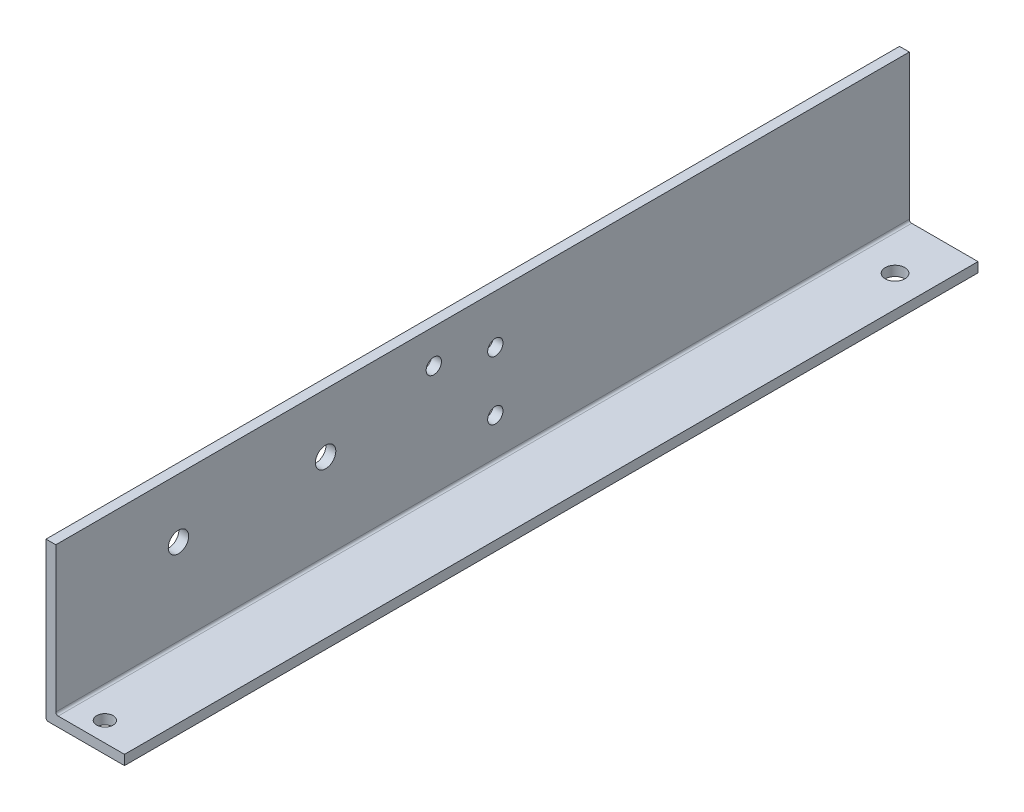
ISO-10303-21;
HEADER;
FILE_DESCRIPTION(('STEP AP214'),'2;1');
FILE_NAME('part.step','',(''),(''),'','','');
FILE_SCHEMA(('AUTOMOTIVE_DESIGN { 1 0 10303 214 1 1 1 1 }'));
ENDSEC;
DATA;
#1=APPLICATION_CONTEXT('core data for automotive mechanical design processes');
#2=APPLICATION_PROTOCOL_DEFINITION('international standard','automotive_design',2000,#1);
#3=PRODUCT_CONTEXT('',#1,'mechanical');
#4=PRODUCT('Part','Part','',(#3));
#5=PRODUCT_RELATED_PRODUCT_CATEGORY('part','',(#4));
#6=PRODUCT_DEFINITION_FORMATION('','',#4);
#7=PRODUCT_DEFINITION_CONTEXT('part definition',#1,'design');
#8=PRODUCT_DEFINITION('design','',#6,#7);
#9=PRODUCT_DEFINITION_SHAPE('','',#8);
#10=(LENGTH_UNIT() NAMED_UNIT(*) SI_UNIT(.MILLI.,.METRE.));
#11=(NAMED_UNIT(*) PLANE_ANGLE_UNIT() SI_UNIT($,.RADIAN.));
#12=(NAMED_UNIT(*) SI_UNIT($,.STERADIAN.) SOLID_ANGLE_UNIT());
#13=UNCERTAINTY_MEASURE_WITH_UNIT(LENGTH_MEASURE(1.E-05),#10,'distance_accuracy_value','');
#14=(GEOMETRIC_REPRESENTATION_CONTEXT(3) GLOBAL_UNCERTAINTY_ASSIGNED_CONTEXT((#13)) GLOBAL_UNIT_ASSIGNED_CONTEXT((#10,
#11,#12)) REPRESENTATION_CONTEXT('',''));
#15=CARTESIAN_POINT('',(0.,0.,0.));
#16=DIRECTION('',(0.,0.,1.));
#17=DIRECTION('',(1.,0.,0.));
#18=AXIS2_PLACEMENT_3D('',#15,#16,#17);
#19=CARTESIAN_POINT('',(0.,50.8,276.225));
#20=DIRECTION('',(0.,-1.,0.));
#21=DIRECTION('',(0.,0.,-1.));
#22=AXIS2_PLACEMENT_3D('',#19,#20,#21);
#23=PLANE('',#22);
#24=DIRECTION('',(-1.,0.,0.));
#25=VECTOR('',#24,1.);
#26=CARTESIAN_POINT('',(0.,50.8,0.));
#27=LINE('',#26,#25);
#28=CARTESIAN_POINT('',(3.17499999999999,50.8,0.));
#29=VERTEX_POINT('',#28);
#30=CARTESIAN_POINT('',(0.,50.8,0.));
#31=VERTEX_POINT('',#30);
#32=EDGE_CURVE('E129',#29,#31,#27,.T.);
#33=ORIENTED_EDGE('',*,*,#32,.T.);
#34=DIRECTION('',(0.,0.,-1.));
#35=VECTOR('',#34,1.);
#36=CARTESIAN_POINT('',(0.,50.8,276.225));
#37=LINE('',#36,#35);
#38=CARTESIAN_POINT('',(0.,50.8,276.225));
#39=VERTEX_POINT('',#38);
#40=EDGE_CURVE('E11',#39,#31,#37,.T.);
#41=ORIENTED_EDGE('',*,*,#40,.F.);
#42=DIRECTION('',(-1.,0.,0.));
#43=VECTOR('',#42,1.);
#44=CARTESIAN_POINT('',(0.,50.8,276.225));
#45=LINE('',#44,#43);
#46=CARTESIAN_POINT('',(3.17499999999999,50.8,276.225));
#47=VERTEX_POINT('',#46);
#48=EDGE_CURVE('E144',#47,#39,#45,.T.);
#49=ORIENTED_EDGE('',*,*,#48,.F.);
#50=DIRECTION('',(0.,0.,-1.));
#51=VECTOR('',#50,1.);
#52=CARTESIAN_POINT('',(3.17499999999999,50.8,276.225));
#53=LINE('',#52,#51);
#54=EDGE_CURVE('E125',#47,#29,#53,.T.);
#55=ORIENTED_EDGE('',*,*,#54,.T.);
#56=EDGE_LOOP('',(#33,#41,#49,#55));
#57=FACE_BOUND('',#56,.T.);
#58=ADVANCED_FACE('F33',(#57),#23,.F.);
#59=CARTESIAN_POINT('',(0.,0.762000000000005,276.225));
#60=DIRECTION('',(1.,0.,0.));
#61=DIRECTION('',(0.,0.,-1.));
#62=AXIS2_PLACEMENT_3D('',#59,#60,#61);
#63=PLANE('',#62);
#64=CARTESIAN_POINT('',(0.,39.759636,153.898092));
#65=DIRECTION('',(-1.,0.,0.));
#66=DIRECTION('',(0.,0.,1.));
#67=AXIS2_PLACEMENT_3D('',#64,#65,#66);
#68=CIRCLE('',#67,2.47650000000003);
#69=CARTESIAN_POINT('',(0.,39.759636,156.374592));
#70=VERTEX_POINT('',#69);
#71=EDGE_CURVE('E209',#70,#70,#68,.T.);
#72=ORIENTED_EDGE('',*,*,#71,.F.);
#73=EDGE_LOOP('',(#72));
#74=FACE_BOUND('',#73,.T.);
#75=CARTESIAN_POINT('',(0.,31.75,236.5375));
#76=DIRECTION('',(1.,0.,0.));
#77=DIRECTION('',(0.,0.,-1.));
#78=AXIS2_PLACEMENT_3D('',#75,#76,#77);
#79=CIRCLE('',#78,3.30199999999998);
#80=CARTESIAN_POINT('',(0.,31.75,233.2355));
#81=VERTEX_POINT('',#80);
#82=EDGE_CURVE('E188',#81,#81,#79,.F.);
#83=ORIENTED_EDGE('',*,*,#82,.F.);
#84=EDGE_LOOP('',(#83));
#85=FACE_BOUND('',#84,.T.);
#86=CARTESIAN_POINT('',(0.,16.002,133.985));
#87=DIRECTION('',(1.,0.,0.));
#88=DIRECTION('',(0.,0.,-1.));
#89=AXIS2_PLACEMENT_3D('',#86,#87,#88);
#90=CIRCLE('',#89,2.4765);
#91=CARTESIAN_POINT('',(0.,16.002,131.5085));
#92=VERTEX_POINT('',#91);
#93=EDGE_CURVE('E197',#92,#92,#90,.F.);
#94=ORIENTED_EDGE('',*,*,#93,.F.);
#95=EDGE_LOOP('',(#94));
#96=FACE_BOUND('',#95,.T.);
#97=CARTESIAN_POINT('',(0.,35.052,133.985));
#98=DIRECTION('',(1.,0.,0.));
#99=DIRECTION('',(0.,0.,-1.));
#100=AXIS2_PLACEMENT_3D('',#97,#98,#99);
#101=CIRCLE('',#100,2.47650000000003);
#102=CARTESIAN_POINT('',(0.,35.052,131.5085));
#103=VERTEX_POINT('',#102);
#104=EDGE_CURVE('E189',#103,#103,#101,.F.);
#105=ORIENTED_EDGE('',*,*,#104,.F.);
#106=EDGE_LOOP('',(#105));
#107=FACE_BOUND('',#106,.T.);
#108=CARTESIAN_POINT('',(0.,31.75,188.9125));
#109=DIRECTION('',(1.,0.,0.));
#110=DIRECTION('',(0.,0.,-1.));
#111=AXIS2_PLACEMENT_3D('',#108,#109,#110);
#112=CIRCLE('',#111,3.30199999999998);
#113=CARTESIAN_POINT('',(0.,31.75,185.6105));
#114=VERTEX_POINT('',#113);
#115=EDGE_CURVE('E182',#114,#114,#112,.F.);
#116=ORIENTED_EDGE('',*,*,#115,.F.);
#117=EDGE_LOOP('',(#116));
#118=FACE_BOUND('',#117,.T.);
#119=DIRECTION('',(0.,-1.,0.));
#120=VECTOR('',#119,1.);
#121=CARTESIAN_POINT('',(0.,0.762000000000005,0.));
#122=LINE('',#121,#120);
#123=CARTESIAN_POINT('',(0.,0.762000000000005,0.));
#124=VERTEX_POINT('',#123);
#125=EDGE_CURVE('E132',#31,#124,#122,.T.);
#126=ORIENTED_EDGE('',*,*,#125,.T.);
#127=DIRECTION('',(0.,0.,-1.));
#128=VECTOR('',#127,1.);
#129=CARTESIAN_POINT('',(0.,0.762000000000005,276.225));
#130=LINE('',#129,#128);
#131=CARTESIAN_POINT('',(0.,0.762000000000005,276.225));
#132=VERTEX_POINT('',#131);
#133=EDGE_CURVE('E41',#132,#124,#130,.T.);
#134=ORIENTED_EDGE('',*,*,#133,.F.);
#135=DIRECTION('',(0.,-1.,0.));
#136=VECTOR('',#135,1.);
#137=CARTESIAN_POINT('',(0.,0.762000000000005,276.225));
#138=LINE('',#137,#136);
#139=EDGE_CURVE('E92',#39,#132,#138,.T.);
#140=ORIENTED_EDGE('',*,*,#139,.F.);
#141=ORIENTED_EDGE('',*,*,#40,.T.);
#142=EDGE_LOOP('',(#126,#134,#140,#141));
#143=FACE_BOUND('',#142,.T.);
#144=ADVANCED_FACE('F241',(#74,#85,#96,#107,#118,#143),#63,.F.);
#145=CARTESIAN_POINT('',(0.762,0.762,276.225));
#146=DIRECTION('',(0.,0.,-1.));
#147=DIRECTION('',(-1.,0.,0.));
#148=AXIS2_PLACEMENT_3D('',#145,#146,#147);
#149=CYLINDRICAL_SURFACE('',#148,0.762);
#150=CARTESIAN_POINT('',(0.762,0.762,0.));
#151=DIRECTION('',(0.,0.,1.));
#152=DIRECTION('',(1.,0.,0.));
#153=AXIS2_PLACEMENT_3D('',#150,#151,#152);
#154=CIRCLE('',#153,0.762);
#155=CARTESIAN_POINT('',(0.762000000000005,0.,0.));
#156=VERTEX_POINT('',#155);
#157=EDGE_CURVE('E135',#124,#156,#154,.T.);
#158=ORIENTED_EDGE('',*,*,#157,.T.);
#159=DIRECTION('',(0.,0.,-1.));
#160=VECTOR('',#159,1.);
#161=CARTESIAN_POINT('',(0.762000000000005,0.,276.225));
#162=LINE('',#161,#160);
#163=CARTESIAN_POINT('',(0.762000000000005,0.,276.225));
#164=VERTEX_POINT('',#163);
#165=EDGE_CURVE('E151',#164,#156,#162,.T.);
#166=ORIENTED_EDGE('',*,*,#165,.F.);
#167=CARTESIAN_POINT('',(0.762,0.762,276.225));
#168=DIRECTION('',(0.,0.,1.));
#169=DIRECTION('',(1.,0.,0.));
#170=AXIS2_PLACEMENT_3D('',#167,#168,#169);
#171=CIRCLE('',#170,0.762);
#172=EDGE_CURVE('E159',#132,#164,#171,.T.);
#173=ORIENTED_EDGE('',*,*,#172,.F.);
#174=ORIENTED_EDGE('',*,*,#133,.T.);
#175=EDGE_LOOP('',(#158,#166,#173,#174));
#176=FACE_BOUND('',#175,.T.);
#177=ADVANCED_FACE('F157',(#176),#149,.T.);
#178=CARTESIAN_POINT('',(0.762000000000005,0.,276.225));
#179=DIRECTION('',(0.,1.,0.));
#180=DIRECTION('',(0.,0.,1.));
#181=AXIS2_PLACEMENT_3D('',#178,#179,#180);
#182=PLANE('',#181);
#183=CARTESIAN_POINT('',(15.24,0.,16.686276));
#184=DIRECTION('',(0.,1.,0.));
#185=DIRECTION('',(0.,0.,1.));
#186=AXIS2_PLACEMENT_3D('',#183,#184,#185);
#187=CIRCLE('',#186,3.175);
#188=CARTESIAN_POINT('',(15.24,0.,19.861276));
#189=VERTEX_POINT('',#188);
#190=EDGE_CURVE('E212',#189,#189,#187,.F.);
#191=ORIENTED_EDGE('',*,*,#190,.F.);
#192=EDGE_LOOP('',(#191));
#193=FACE_BOUND('',#192,.T.);
#194=CARTESIAN_POINT('',(12.7,0.,269.875));
#195=DIRECTION('',(0.,-1.,0.));
#196=DIRECTION('',(0.,0.,-1.));
#197=AXIS2_PLACEMENT_3D('',#194,#195,#196);
#198=CIRCLE('',#197,2.667);
#199=CARTESIAN_POINT('',(12.7,0.,267.208));
#200=VERTEX_POINT('',#199);
#201=EDGE_CURVE('E179',#200,#200,#198,.T.);
#202=ORIENTED_EDGE('',*,*,#201,.F.);
#203=EDGE_LOOP('',(#202));
#204=FACE_BOUND('',#203,.T.);
#205=DIRECTION('',(1.,0.,0.));
#206=VECTOR('',#205,1.);
#207=CARTESIAN_POINT('',(0.762000000000005,0.,0.));
#208=LINE('',#207,#206);
#209=CARTESIAN_POINT('',(25.4,0.,0.));
#210=VERTEX_POINT('',#209);
#211=EDGE_CURVE('E137',#156,#210,#208,.T.);
#212=ORIENTED_EDGE('',*,*,#211,.T.);
#213=DIRECTION('',(0.,0.,-1.));
#214=VECTOR('',#213,1.);
#215=CARTESIAN_POINT('',(25.4,0.,276.225));
#216=LINE('',#215,#214);
#217=CARTESIAN_POINT('',(25.4,0.,276.225));
#218=VERTEX_POINT('',#217);
#219=EDGE_CURVE('E148',#218,#210,#216,.T.);
#220=ORIENTED_EDGE('',*,*,#219,.F.);
#221=DIRECTION('',(1.,0.,0.));
#222=VECTOR('',#221,1.);
#223=CARTESIAN_POINT('',(0.762000000000005,0.,276.225));
#224=LINE('',#223,#222);
#225=EDGE_CURVE('E171',#164,#218,#224,.T.);
#226=ORIENTED_EDGE('',*,*,#225,.F.);
#227=ORIENTED_EDGE('',*,*,#165,.T.);
#228=EDGE_LOOP('',(#212,#220,#226,#227));
#229=FACE_BOUND('',#228,.T.);
#230=ADVANCED_FACE('F167',(#193,#204,#229),#182,.F.);
#231=CARTESIAN_POINT('',(25.4,0.,276.225));
#232=DIRECTION('',(-1.,0.,0.));
#233=DIRECTION('',(0.,0.,1.));
#234=AXIS2_PLACEMENT_3D('',#231,#232,#233);
#235=PLANE('',#234);
#236=DIRECTION('',(0.,1.,0.));
#237=VECTOR('',#236,1.);
#238=CARTESIAN_POINT('',(25.4,0.,0.));
#239=LINE('',#238,#237);
#240=CARTESIAN_POINT('',(25.4,3.175,0.));
#241=VERTEX_POINT('',#240);
#242=EDGE_CURVE('E139',#210,#241,#239,.T.);
#243=ORIENTED_EDGE('',*,*,#242,.T.);
#244=DIRECTION('',(0.,0.,-1.));
#245=VECTOR('',#244,1.);
#246=CARTESIAN_POINT('',(25.4,3.175,276.225));
#247=LINE('',#246,#245);
#248=CARTESIAN_POINT('',(25.4,3.175,276.225));
#249=VERTEX_POINT('',#248);
#250=EDGE_CURVE('E120',#249,#241,#247,.T.);
#251=ORIENTED_EDGE('',*,*,#250,.F.);
#252=DIRECTION('',(0.,1.,0.));
#253=VECTOR('',#252,1.);
#254=CARTESIAN_POINT('',(25.4,0.,276.225));
#255=LINE('',#254,#253);
#256=EDGE_CURVE('E111',#218,#249,#255,.T.);
#257=ORIENTED_EDGE('',*,*,#256,.F.);
#258=ORIENTED_EDGE('',*,*,#219,.T.);
#259=EDGE_LOOP('',(#243,#251,#257,#258));
#260=FACE_BOUND('',#259,.T.);
#261=ADVANCED_FACE('F170',(#260),#235,.F.);
#262=CARTESIAN_POINT('',(3.93699999999999,3.175,276.225));
#263=DIRECTION('',(0.,-1.,0.));
#264=DIRECTION('',(0.,0.,-1.));
#265=AXIS2_PLACEMENT_3D('',#262,#263,#264);
#266=PLANE('',#265);
#267=CARTESIAN_POINT('',(15.24,3.175,16.686276));
#268=DIRECTION('',(0.,1.,0.));
#269=DIRECTION('',(0.,0.,1.));
#270=AXIS2_PLACEMENT_3D('',#267,#268,#269);
#271=CIRCLE('',#270,3.175);
#272=CARTESIAN_POINT('',(15.24,3.175,19.861276));
#273=VERTEX_POINT('',#272);
#274=EDGE_CURVE('E215',#273,#273,#271,.T.);
#275=ORIENTED_EDGE('',*,*,#274,.F.);
#276=EDGE_LOOP('',(#275));
#277=FACE_BOUND('',#276,.T.);
#278=CARTESIAN_POINT('',(12.7,3.175,269.875));
#279=DIRECTION('',(0.,-1.,0.));
#280=DIRECTION('',(0.,0.,-1.));
#281=AXIS2_PLACEMENT_3D('',#278,#279,#280);
#282=CIRCLE('',#281,2.667);
#283=CARTESIAN_POINT('',(12.7,3.175,267.208));
#284=VERTEX_POINT('',#283);
#285=EDGE_CURVE('E133',#284,#284,#282,.F.);
#286=ORIENTED_EDGE('',*,*,#285,.F.);
#287=EDGE_LOOP('',(#286));
#288=FACE_BOUND('',#287,.T.);
#289=DIRECTION('',(-1.,0.,0.));
#290=VECTOR('',#289,1.);
#291=CARTESIAN_POINT('',(3.93699999999999,3.175,0.));
#292=LINE('',#291,#290);
#293=CARTESIAN_POINT('',(3.93699999999999,3.175,0.));
#294=VERTEX_POINT('',#293);
#295=EDGE_CURVE('E119',#241,#294,#292,.T.);
#296=ORIENTED_EDGE('',*,*,#295,.T.);
#297=DIRECTION('',(0.,0.,-1.));
#298=VECTOR('',#297,1.);
#299=CARTESIAN_POINT('',(3.93699999999999,3.175,276.225));
#300=LINE('',#299,#298);
#301=CARTESIAN_POINT('',(3.93699999999999,3.175,276.225));
#302=VERTEX_POINT('',#301);
#303=EDGE_CURVE('E116',#302,#294,#300,.T.);
#304=ORIENTED_EDGE('',*,*,#303,.F.);
#305=DIRECTION('',(-1.,0.,0.));
#306=VECTOR('',#305,1.);
#307=CARTESIAN_POINT('',(3.93699999999999,3.175,276.225));
#308=LINE('',#307,#306);
#309=EDGE_CURVE('E105',#249,#302,#308,.T.);
#310=ORIENTED_EDGE('',*,*,#309,.F.);
#311=ORIENTED_EDGE('',*,*,#250,.T.);
#312=EDGE_LOOP('',(#296,#304,#310,#311));
#313=FACE_BOUND('',#312,.T.);
#314=ADVANCED_FACE('F117',(#277,#288,#313),#266,.F.);
#315=CARTESIAN_POINT('',(3.93699999999999,3.937,276.225));
#316=DIRECTION('',(0.,0.,-1.));
#317=DIRECTION('',(-1.,0.,0.));
#318=AXIS2_PLACEMENT_3D('',#315,#316,#317);
#319=CYLINDRICAL_SURFACE('',#318,0.762);
#320=CARTESIAN_POINT('',(3.93699999999999,3.937,0.));
#321=DIRECTION('',(0.,0.,-1.));
#322=DIRECTION('',(1.,0.,0.));
#323=AXIS2_PLACEMENT_3D('',#320,#321,#322);
#324=CIRCLE('',#323,0.762);
#325=CARTESIAN_POINT('',(3.17499999999999,3.937,0.));
#326=VERTEX_POINT('',#325);
#327=EDGE_CURVE('E78',#294,#326,#324,.T.);
#328=ORIENTED_EDGE('',*,*,#327,.T.);
#329=DIRECTION('',(0.,0.,-1.));
#330=VECTOR('',#329,1.);
#331=CARTESIAN_POINT('',(3.17499999999999,3.937,276.225));
#332=LINE('',#331,#330);
#333=CARTESIAN_POINT('',(3.17499999999999,3.937,276.225));
#334=VERTEX_POINT('',#333);
#335=EDGE_CURVE('E121',#334,#326,#332,.T.);
#336=ORIENTED_EDGE('',*,*,#335,.F.);
#337=CARTESIAN_POINT('',(3.93699999999999,3.937,276.225));
#338=DIRECTION('',(0.,0.,-1.));
#339=DIRECTION('',(1.,0.,0.));
#340=AXIS2_PLACEMENT_3D('',#337,#338,#339);
#341=CIRCLE('',#340,0.762);
#342=EDGE_CURVE('E109',#302,#334,#341,.T.);
#343=ORIENTED_EDGE('',*,*,#342,.F.);
#344=ORIENTED_EDGE('',*,*,#303,.T.);
#345=EDGE_LOOP('',(#328,#336,#343,#344));
#346=FACE_BOUND('',#345,.T.);
#347=ADVANCED_FACE('F123',(#346),#319,.F.);
#348=CARTESIAN_POINT('',(3.17499999999999,50.8,276.225));
#349=DIRECTION('',(-1.,0.,0.));
#350=DIRECTION('',(0.,-1.,0.));
#351=AXIS2_PLACEMENT_3D('',#348,#349,#350);
#352=PLANE('',#351);
#353=CARTESIAN_POINT('',(3.17499999999999,39.759636,153.898092));
#354=DIRECTION('',(-1.,0.,0.));
#355=DIRECTION('',(0.,-1.,0.));
#356=AXIS2_PLACEMENT_3D('',#353,#354,#355);
#357=CIRCLE('',#356,2.47650000000003);
#358=CARTESIAN_POINT('',(3.17499999999999,37.283136,153.898092));
#359=VERTEX_POINT('',#358);
#360=EDGE_CURVE('E196',#359,#359,#357,.F.);
#361=ORIENTED_EDGE('',*,*,#360,.F.);
#362=EDGE_LOOP('',(#361));
#363=FACE_BOUND('',#362,.T.);
#364=CARTESIAN_POINT('',(3.17499999999999,31.75,236.5375));
#365=DIRECTION('',(1.,0.,0.));
#366=DIRECTION('',(0.,1.,0.));
#367=AXIS2_PLACEMENT_3D('',#364,#365,#366);
#368=CIRCLE('',#367,3.30199999999998);
#369=CARTESIAN_POINT('',(3.17499999999999,35.052,236.5375));
#370=VERTEX_POINT('',#369);
#371=EDGE_CURVE('E200',#370,#370,#368,.T.);
#372=ORIENTED_EDGE('',*,*,#371,.F.);
#373=EDGE_LOOP('',(#372));
#374=FACE_BOUND('',#373,.T.);
#375=CARTESIAN_POINT('',(3.17499999999999,16.002,133.985));
#376=DIRECTION('',(1.,0.,0.));
#377=DIRECTION('',(0.,1.,0.));
#378=AXIS2_PLACEMENT_3D('',#375,#376,#377);
#379=CIRCLE('',#378,2.4765);
#380=CARTESIAN_POINT('',(3.17499999999999,18.4785,133.985));
#381=VERTEX_POINT('',#380);
#382=EDGE_CURVE('E192',#381,#381,#379,.T.);
#383=ORIENTED_EDGE('',*,*,#382,.F.);
#384=EDGE_LOOP('',(#383));
#385=FACE_BOUND('',#384,.T.);
#386=CARTESIAN_POINT('',(3.17499999999999,35.052,133.985));
#387=DIRECTION('',(1.,0.,0.));
#388=DIRECTION('',(0.,1.,0.));
#389=AXIS2_PLACEMENT_3D('',#386,#387,#388);
#390=CIRCLE('',#389,2.47650000000003);
#391=CARTESIAN_POINT('',(3.17499999999999,37.5285,133.985));
#392=VERTEX_POINT('',#391);
#393=EDGE_CURVE('E193',#392,#392,#390,.T.);
#394=ORIENTED_EDGE('',*,*,#393,.F.);
#395=EDGE_LOOP('',(#394));
#396=FACE_BOUND('',#395,.T.);
#397=CARTESIAN_POINT('',(3.17499999999999,31.75,188.9125));
#398=DIRECTION('',(1.,0.,0.));
#399=DIRECTION('',(0.,1.,0.));
#400=AXIS2_PLACEMENT_3D('',#397,#398,#399);
#401=CIRCLE('',#400,3.30199999999998);
#402=CARTESIAN_POINT('',(3.17499999999999,35.052,188.9125));
#403=VERTEX_POINT('',#402);
#404=EDGE_CURVE('E185',#403,#403,#401,.T.);
#405=ORIENTED_EDGE('',*,*,#404,.F.);
#406=EDGE_LOOP('',(#405));
#407=FACE_BOUND('',#406,.T.);
#408=DIRECTION('',(0.,1.,0.));
#409=VECTOR('',#408,1.);
#410=CARTESIAN_POINT('',(3.17499999999999,50.8,0.));
#411=LINE('',#410,#409);
#412=EDGE_CURVE('E84',#326,#29,#411,.T.);
#413=ORIENTED_EDGE('',*,*,#412,.T.);
#414=ORIENTED_EDGE('',*,*,#54,.F.);
#415=DIRECTION('',(0.,1.,0.));
#416=VECTOR('',#415,1.);
#417=CARTESIAN_POINT('',(3.17499999999999,50.8,276.225));
#418=LINE('',#417,#416);
#419=EDGE_CURVE('E49',#334,#47,#418,.T.);
#420=ORIENTED_EDGE('',*,*,#419,.F.);
#421=ORIENTED_EDGE('',*,*,#335,.T.);
#422=EDGE_LOOP('',(#413,#414,#420,#421));
#423=FACE_BOUND('',#422,.T.);
#424=ADVANCED_FACE('F252',(#363,#374,#385,#396,#407,#423),#352,.F.);
#425=CARTESIAN_POINT('',(3.93699999999999,3.937,276.225));
#426=DIRECTION('',(0.,0.,1.));
#427=DIRECTION('',(1.,0.,0.));
#428=AXIS2_PLACEMENT_3D('',#425,#426,#427);
#429=PLANE('',#428);
#430=ORIENTED_EDGE('',*,*,#48,.T.);
#431=ORIENTED_EDGE('',*,*,#139,.T.);
#432=ORIENTED_EDGE('',*,*,#172,.T.);
#433=ORIENTED_EDGE('',*,*,#225,.T.);
#434=ORIENTED_EDGE('',*,*,#256,.T.);
#435=ORIENTED_EDGE('',*,*,#309,.T.);
#436=ORIENTED_EDGE('',*,*,#342,.T.);
#437=ORIENTED_EDGE('',*,*,#419,.T.);
#438=EDGE_LOOP('',(#430,#431,#432,#433,#434,#435,#436,#437));
#439=FACE_BOUND('',#438,.T.);
#440=ADVANCED_FACE('F107',(#439),#429,.T.);
#441=CARTESIAN_POINT('',(3.93699999999999,3.937,0.));
#442=DIRECTION('',(0.,0.,1.));
#443=DIRECTION('',(1.,0.,0.));
#444=AXIS2_PLACEMENT_3D('',#441,#442,#443);
#445=PLANE('',#444);
#446=ORIENTED_EDGE('',*,*,#32,.F.);
#447=ORIENTED_EDGE('',*,*,#412,.F.);
#448=ORIENTED_EDGE('',*,*,#327,.F.);
#449=ORIENTED_EDGE('',*,*,#295,.F.);
#450=ORIENTED_EDGE('',*,*,#242,.F.);
#451=ORIENTED_EDGE('',*,*,#211,.F.);
#452=ORIENTED_EDGE('',*,*,#157,.F.);
#453=ORIENTED_EDGE('',*,*,#125,.F.);
#454=EDGE_LOOP('',(#446,#447,#448,#449,#450,#451,#452,#453));
#455=FACE_BOUND('',#454,.T.);
#456=ADVANCED_FACE('F163',(#455),#445,.F.);
#457=CARTESIAN_POINT('',(12.7,10.7184151416981,269.875));
#458=DIRECTION('',(0.,-1.,0.));
#459=DIRECTION('',(0.,0.,-1.));
#460=AXIS2_PLACEMENT_3D('',#457,#458,#459);
#461=CYLINDRICAL_SURFACE('',#460,2.667);
#462=ORIENTED_EDGE('',*,*,#285,.T.);
#463=EDGE_LOOP('',(#462));
#464=FACE_BOUND('',#463,.T.);
#465=ORIENTED_EDGE('',*,*,#201,.T.);
#466=EDGE_LOOP('',(#465));
#467=FACE_BOUND('',#466,.T.);
#468=ADVANCED_FACE('F226',(#464,#467),#461,.F.);
#469=CARTESIAN_POINT('',(-9.33946636591186,31.75,188.9125));
#470=DIRECTION('',(1.,0.,0.));
#471=DIRECTION('',(0.,1.,0.));
#472=AXIS2_PLACEMENT_3D('',#469,#470,#471);
#473=CYLINDRICAL_SURFACE('',#472,3.30199999999998);
#474=ORIENTED_EDGE('',*,*,#115,.T.);
#475=EDGE_LOOP('',(#474));
#476=FACE_BOUND('',#475,.T.);
#477=ORIENTED_EDGE('',*,*,#404,.T.);
#478=EDGE_LOOP('',(#477));
#479=FACE_BOUND('',#478,.T.);
#480=ADVANCED_FACE('F229',(#476,#479),#473,.F.);
#481=CARTESIAN_POINT('',(-9.33946636591186,35.052,133.985));
#482=DIRECTION('',(1.,0.,0.));
#483=DIRECTION('',(0.,1.,0.));
#484=AXIS2_PLACEMENT_3D('',#481,#482,#483);
#485=CYLINDRICAL_SURFACE('',#484,2.47650000000003);
#486=ORIENTED_EDGE('',*,*,#104,.T.);
#487=EDGE_LOOP('',(#486));
#488=FACE_BOUND('',#487,.T.);
#489=ORIENTED_EDGE('',*,*,#393,.T.);
#490=EDGE_LOOP('',(#489));
#491=FACE_BOUND('',#490,.T.);
#492=ADVANCED_FACE('F269',(#488,#491),#485,.F.);
#493=CARTESIAN_POINT('',(-9.33946636591186,16.002,133.985));
#494=DIRECTION('',(1.,0.,0.));
#495=DIRECTION('',(0.,1.,0.));
#496=AXIS2_PLACEMENT_3D('',#493,#494,#495);
#497=CYLINDRICAL_SURFACE('',#496,2.4765);
#498=ORIENTED_EDGE('',*,*,#93,.T.);
#499=EDGE_LOOP('',(#498));
#500=FACE_BOUND('',#499,.T.);
#501=ORIENTED_EDGE('',*,*,#382,.T.);
#502=EDGE_LOOP('',(#501));
#503=FACE_BOUND('',#502,.T.);
#504=ADVANCED_FACE('F273',(#500,#503),#497,.F.);
#505=CARTESIAN_POINT('',(-9.33946636591186,31.75,236.5375));
#506=DIRECTION('',(1.,0.,0.));
#507=DIRECTION('',(0.,1.,0.));
#508=AXIS2_PLACEMENT_3D('',#505,#506,#507);
#509=CYLINDRICAL_SURFACE('',#508,3.30199999999998);
#510=ORIENTED_EDGE('',*,*,#82,.T.);
#511=EDGE_LOOP('',(#510));
#512=FACE_BOUND('',#511,.T.);
#513=ORIENTED_EDGE('',*,*,#371,.T.);
#514=EDGE_LOOP('',(#513));
#515=FACE_BOUND('',#514,.T.);
#516=ADVANCED_FACE('F277',(#512,#515),#509,.F.);
#517=CARTESIAN_POINT('',(10.179599774434,39.759636,153.898092));
#518=DIRECTION('',(-1.,0.,0.));
#519=DIRECTION('',(0.,0.,1.));
#520=AXIS2_PLACEMENT_3D('',#517,#518,#519);
#521=CYLINDRICAL_SURFACE('',#520,2.47650000000003);
#522=ORIENTED_EDGE('',*,*,#360,.T.);
#523=EDGE_LOOP('',(#522));
#524=FACE_BOUND('',#523,.T.);
#525=ORIENTED_EDGE('',*,*,#71,.T.);
#526=EDGE_LOOP('',(#525));
#527=FACE_BOUND('',#526,.T.);
#528=ADVANCED_FACE('F281',(#524,#527),#521,.F.);
#529=CARTESIAN_POINT('',(15.24,-8.98025612106915,16.686276));
#530=DIRECTION('',(0.,1.,0.));
#531=DIRECTION('',(0.,0.,1.));
#532=AXIS2_PLACEMENT_3D('',#529,#530,#531);
#533=CYLINDRICAL_SURFACE('',#532,3.175);
#534=ORIENTED_EDGE('',*,*,#190,.T.);
#535=EDGE_LOOP('',(#534));
#536=FACE_BOUND('',#535,.T.);
#537=ORIENTED_EDGE('',*,*,#274,.T.);
#538=EDGE_LOOP('',(#537));
#539=FACE_BOUND('',#538,.T.);
#540=ADVANCED_FACE('F219',(#536,#539),#533,.F.);
#541=CLOSED_SHELL('',(#58,#144,#177,#230,#261,#314,#347,#424,#440,#456,#468,#480,#492,#504,#516,
#528,#540));
#542=MANIFOLD_SOLID_BREP('B2',#541);
#543=ADVANCED_BREP_SHAPE_REPRESENTATION('',(#18,#542),#14);
#544=SHAPE_DEFINITION_REPRESENTATION(#9,#543);
ENDSEC;
END-ISO-10303-21;
